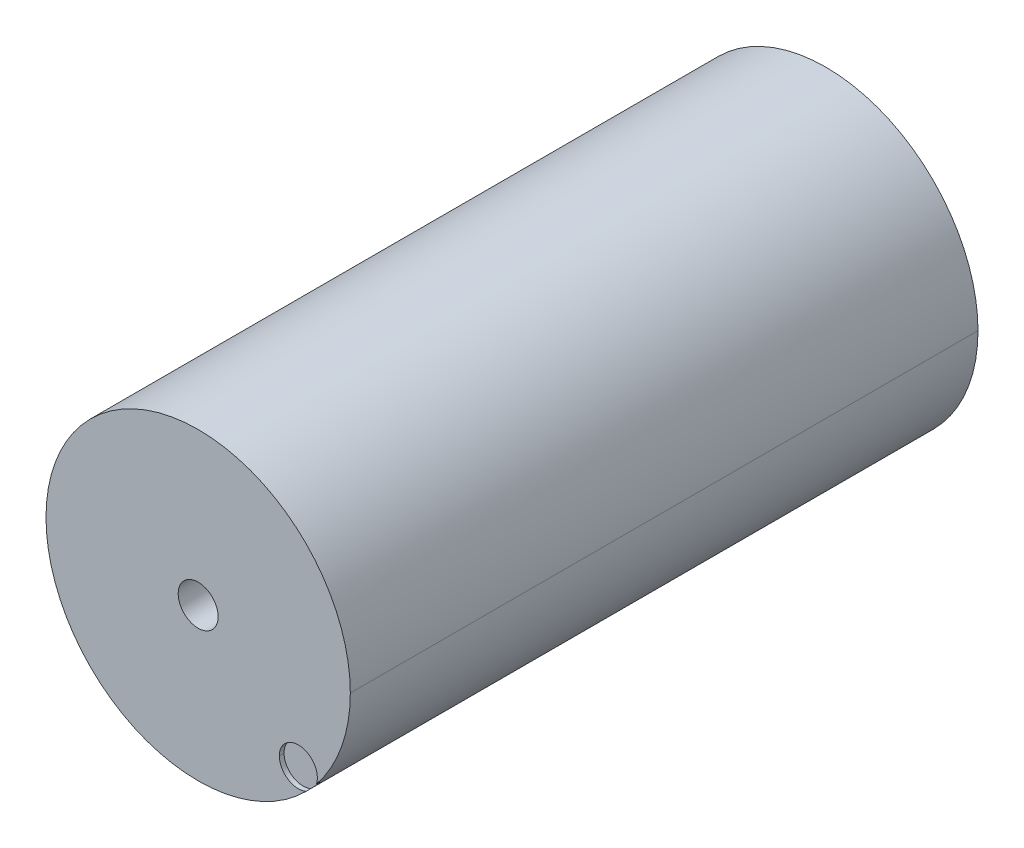
ISO-10303-21;
HEADER;
FILE_DESCRIPTION(('STEP AP214'),'2;1');
FILE_NAME('part.step','',(''),(''),'','','');
FILE_SCHEMA(('AUTOMOTIVE_DESIGN { 1 0 10303 214 1 1 1 1 }'));
ENDSEC;
DATA;
#1=APPLICATION_CONTEXT('core data for automotive mechanical design processes');
#2=APPLICATION_PROTOCOL_DEFINITION('international standard','automotive_design',2000,#1);
#3=PRODUCT_CONTEXT('',#1,'mechanical');
#4=PRODUCT('Part','Part','',(#3));
#5=PRODUCT_RELATED_PRODUCT_CATEGORY('part','',(#4));
#6=PRODUCT_DEFINITION_FORMATION('','',#4);
#7=PRODUCT_DEFINITION_CONTEXT('part definition',#1,'design');
#8=PRODUCT_DEFINITION('design','',#6,#7);
#9=PRODUCT_DEFINITION_SHAPE('','',#8);
#10=(LENGTH_UNIT() NAMED_UNIT(*) SI_UNIT(.MILLI.,.METRE.));
#11=(NAMED_UNIT(*) PLANE_ANGLE_UNIT() SI_UNIT($,.RADIAN.));
#12=(NAMED_UNIT(*) SI_UNIT($,.STERADIAN.) SOLID_ANGLE_UNIT());
#13=UNCERTAINTY_MEASURE_WITH_UNIT(LENGTH_MEASURE(1.E-05),#10,'distance_accuracy_value','');
#14=(GEOMETRIC_REPRESENTATION_CONTEXT(3) GLOBAL_UNCERTAINTY_ASSIGNED_CONTEXT((#13)) GLOBAL_UNIT_ASSIGNED_CONTEXT((#10,
#11,#12)) REPRESENTATION_CONTEXT('',''));
#15=CARTESIAN_POINT('',(0.,0.,0.));
#16=DIRECTION('',(0.,0.,1.));
#17=DIRECTION('',(1.,0.,0.));
#18=AXIS2_PLACEMENT_3D('',#15,#16,#17);
#19=CARTESIAN_POINT('',(10.5321145046291,-9.45328245563246,65.5));
#20=DIRECTION('',(0.,0.,1.));
#21=DIRECTION('',(1.,0.,0.));
#22=AXIS2_PLACEMENT_3D('',#19,#20,#21);
#23=PLANE('',#22);
#24=CARTESIAN_POINT('',(0.,0.,65.5));
#25=DIRECTION('',(0.,0.,1.));
#26=DIRECTION('',(1.,0.,0.));
#27=AXIS2_PLACEMENT_3D('',#24,#25,#26);
#28=CIRCLE('',#27,16.);
#29=CARTESIAN_POINT('',(11.3480272997679,-11.2792852789404,65.5));
#30=VERTEX_POINT('',#29);
#31=CARTESIAN_POINT('',(12.435338152409,-10.0678878139975,65.5));
#32=VERTEX_POINT('',#31);
#33=EDGE_CURVE('E59',#30,#32,#28,.T.);
#34=ORIENTED_EDGE('',*,*,#33,.T.);
#35=CARTESIAN_POINT('',(10.5321145046291,-9.45328245563246,65.5));
#36=DIRECTION('',(0.,0.,1.));
#37=DIRECTION('',(1.,0.,0.));
#38=AXIS2_PLACEMENT_3D('',#35,#36,#37);
#39=CIRCLE('',#38,2.);
#40=CARTESIAN_POINT('',(12.5321145046291,-9.45328245563246,65.5));
#41=VERTEX_POINT('',#40);
#42=EDGE_CURVE('E11',#32,#41,#39,.T.);
#43=ORIENTED_EDGE('',*,*,#42,.T.);
#44=CARTESIAN_POINT('',(10.5321145046291,-9.45328245563246,65.5));
#45=DIRECTION('',(0.,0.,1.));
#46=DIRECTION('',(1.,0.,0.));
#47=AXIS2_PLACEMENT_3D('',#44,#45,#46);
#48=CIRCLE('',#47,2.);
#49=CARTESIAN_POINT('',(8.53211450462905,-9.45328245563246,65.5));
#50=VERTEX_POINT('',#49);
#51=EDGE_CURVE('E164',#41,#50,#48,.T.);
#52=ORIENTED_EDGE('',*,*,#51,.T.);
#53=CARTESIAN_POINT('',(10.5321145046291,-9.45328245563246,65.5));
#54=DIRECTION('',(0.,0.,1.));
#55=DIRECTION('',(1.,0.,0.));
#56=AXIS2_PLACEMENT_3D('',#53,#54,#55);
#57=CIRCLE('',#56,2.);
#58=EDGE_CURVE('E158',#50,#30,#57,.T.);
#59=ORIENTED_EDGE('',*,*,#58,.T.);
#60=EDGE_LOOP('',(#34,#43,#52,#59));
#61=FACE_BOUND('',#60,.T.);
#62=ADVANCED_FACE('F48',(#61),#23,.T.);
#63=CARTESIAN_POINT('',(10.5321145046291,-9.45328245563246,65.5));
#64=DIRECTION('',(0.,0.,1.));
#65=DIRECTION('',(1.,0.,0.));
#66=AXIS2_PLACEMENT_3D('',#63,#64,#65);
#67=CYLINDRICAL_SURFACE('',#66,2.);
#68=DIRECTION('',(0.,0.,1.));
#69=VECTOR('',#68,1.);
#70=CARTESIAN_POINT('',(12.5321145046291,-9.45328245563246,65.5));
#71=LINE('',#70,#69);
#72=CARTESIAN_POINT('',(12.5321145046291,-9.45328245563246,66.));
#73=VERTEX_POINT('',#72);
#74=EDGE_CURVE('E167',#41,#73,#71,.T.);
#75=ORIENTED_EDGE('',*,*,#74,.F.);
#76=ORIENTED_EDGE('',*,*,#42,.F.);
#77=DIRECTION('',(0.,0.,-1.));
#78=VECTOR('',#77,1.);
#79=CARTESIAN_POINT('',(12.4353381524091,-10.0678878139975,67.5));
#80=LINE('',#79,#78);
#81=CARTESIAN_POINT('',(12.4353381524091,-10.0678878139975,66.));
#82=VERTEX_POINT('',#81);
#83=EDGE_CURVE('E134',#82,#32,#80,.T.);
#84=ORIENTED_EDGE('',*,*,#83,.F.);
#85=CARTESIAN_POINT('',(10.5321145046291,-9.45328245563246,66.));
#86=DIRECTION('',(0.,0.,1.));
#87=DIRECTION('',(1.,0.,0.));
#88=AXIS2_PLACEMENT_3D('',#85,#86,#87);
#89=CIRCLE('',#88,2.);
#90=EDGE_CURVE('E141',#82,#73,#89,.T.);
#91=ORIENTED_EDGE('',*,*,#90,.T.);
#92=EDGE_LOOP('',(#75,#76,#84,#91));
#93=FACE_BOUND('',#92,.T.);
#94=ADVANCED_FACE('F50',(#93),#67,.F.);
#95=CARTESIAN_POINT('',(0.,0.,66.));
#96=DIRECTION('',(0.,0.,-1.));
#97=DIRECTION('',(-1.,0.,0.));
#98=AXIS2_PLACEMENT_3D('',#95,#96,#97);
#99=CYLINDRICAL_SURFACE('',#98,16.);
#100=DIRECTION('',(0.,0.,-1.));
#101=VECTOR('',#100,1.);
#102=CARTESIAN_POINT('',(16.,0.,66.));
#103=LINE('',#102,#101);
#104=CARTESIAN_POINT('',(16.,0.,66.));
#105=VERTEX_POINT('',#104);
#106=CARTESIAN_POINT('',(16.,0.,0.));
#107=VERTEX_POINT('',#106);
#108=EDGE_CURVE('E143',#105,#107,#103,.T.);
#109=ORIENTED_EDGE('',*,*,#108,.F.);
#110=CARTESIAN_POINT('',(0.,0.,66.));
#111=DIRECTION('',(0.,0.,1.));
#112=DIRECTION('',(1.,0.,0.));
#113=AXIS2_PLACEMENT_3D('',#110,#111,#112);
#114=CIRCLE('',#113,16.);
#115=EDGE_CURVE('E154',#82,#105,#114,.T.);
#116=ORIENTED_EDGE('',*,*,#115,.F.);
#117=ORIENTED_EDGE('',*,*,#83,.T.);
#118=ORIENTED_EDGE('',*,*,#33,.F.);
#119=DIRECTION('',(0.,0.,1.));
#120=VECTOR('',#119,1.);
#121=CARTESIAN_POINT('',(11.3480272997678,-11.2792852789405,67.5));
#122=LINE('',#121,#120);
#123=CARTESIAN_POINT('',(11.3480272997678,-11.2792852789405,66.));
#124=VERTEX_POINT('',#123);
#125=EDGE_CURVE('E168',#30,#124,#122,.T.);
#126=ORIENTED_EDGE('',*,*,#125,.T.);
#127=CARTESIAN_POINT('',(0.,0.,66.));
#128=DIRECTION('',(0.,0.,1.));
#129=DIRECTION('',(1.,0.,0.));
#130=AXIS2_PLACEMENT_3D('',#127,#128,#129);
#131=CIRCLE('',#130,16.);
#132=CARTESIAN_POINT('',(-16.,0.,66.));
#133=VERTEX_POINT('',#132);
#134=EDGE_CURVE('E101',#133,#124,#131,.T.);
#135=ORIENTED_EDGE('',*,*,#134,.F.);
#136=DIRECTION('',(0.,0.,-1.));
#137=VECTOR('',#136,1.);
#138=CARTESIAN_POINT('',(-16.,0.,66.));
#139=LINE('',#138,#137);
#140=CARTESIAN_POINT('',(-16.,0.,0.));
#141=VERTEX_POINT('',#140);
#142=EDGE_CURVE('E52',#133,#141,#139,.T.);
#143=ORIENTED_EDGE('',*,*,#142,.T.);
#144=CARTESIAN_POINT('',(0.,0.,0.));
#145=DIRECTION('',(0.,0.,1.));
#146=DIRECTION('',(1.,0.,0.));
#147=AXIS2_PLACEMENT_3D('',#144,#145,#146);
#148=CIRCLE('',#147,16.);
#149=EDGE_CURVE('E125',#141,#107,#148,.T.);
#150=ORIENTED_EDGE('',*,*,#149,.T.);
#151=EDGE_LOOP('',(#109,#116,#117,#118,#126,#135,#143,#150));
#152=FACE_BOUND('',#151,.T.);
#153=ADVANCED_FACE('F137',(#152),#99,.T.);
#154=CARTESIAN_POINT('',(0.,0.,0.));
#155=DIRECTION('',(0.,0.,1.));
#156=DIRECTION('',(1.,0.,0.));
#157=AXIS2_PLACEMENT_3D('',#154,#155,#156);
#158=PLANE('',#157);
#159=CARTESIAN_POINT('',(0.,0.,0.));
#160=DIRECTION('',(0.,0.,-1.));
#161=DIRECTION('',(-1.,0.,0.));
#162=AXIS2_PLACEMENT_3D('',#159,#160,#161);
#163=CIRCLE('',#162,2.1);
#164=CARTESIAN_POINT('',(-2.1,0.,0.));
#165=VERTEX_POINT('',#164);
#166=EDGE_CURVE('E227',#165,#165,#163,.T.);
#167=ORIENTED_EDGE('',*,*,#166,.F.);
#168=EDGE_LOOP('',(#167));
#169=FACE_BOUND('',#168,.T.);
#170=ORIENTED_EDGE('',*,*,#149,.F.);
#171=CARTESIAN_POINT('',(0.,0.,0.));
#172=DIRECTION('',(0.,0.,1.));
#173=DIRECTION('',(1.,0.,0.));
#174=AXIS2_PLACEMENT_3D('',#171,#172,#173);
#175=CIRCLE('',#174,16.);
#176=EDGE_CURVE('E131',#107,#141,#175,.T.);
#177=ORIENTED_EDGE('',*,*,#176,.F.);
#178=EDGE_LOOP('',(#170,#177));
#179=FACE_BOUND('',#178,.T.);
#180=ADVANCED_FACE('F129',(#169,#179),#158,.F.);
#181=CARTESIAN_POINT('',(0.,0.,66.));
#182=DIRECTION('',(0.,0.,1.));
#183=DIRECTION('',(1.,0.,0.));
#184=AXIS2_PLACEMENT_3D('',#181,#182,#183);
#185=PLANE('',#184);
#186=CARTESIAN_POINT('',(0.,0.,66.));
#187=DIRECTION('',(0.,0.,-1.));
#188=DIRECTION('',(-1.,0.,0.));
#189=AXIS2_PLACEMENT_3D('',#186,#187,#188);
#190=CIRCLE('',#189,2.09999999999999);
#191=CARTESIAN_POINT('',(-2.09999999999999,0.,66.));
#192=VERTEX_POINT('',#191);
#193=EDGE_CURVE('E162',#192,#192,#190,.T.);
#194=ORIENTED_EDGE('',*,*,#193,.T.);
#195=EDGE_LOOP('',(#194));
#196=FACE_BOUND('',#195,.T.);
#197=ORIENTED_EDGE('',*,*,#90,.F.);
#198=ORIENTED_EDGE('',*,*,#115,.T.);
#199=CARTESIAN_POINT('',(0.,0.,66.));
#200=DIRECTION('',(0.,0.,1.));
#201=DIRECTION('',(1.,0.,0.));
#202=AXIS2_PLACEMENT_3D('',#199,#200,#201);
#203=CIRCLE('',#202,16.);
#204=EDGE_CURVE('E150',#105,#133,#203,.T.);
#205=ORIENTED_EDGE('',*,*,#204,.T.);
#206=ORIENTED_EDGE('',*,*,#134,.T.);
#207=CARTESIAN_POINT('',(10.5321145046291,-9.45328245563246,66.));
#208=DIRECTION('',(0.,0.,1.));
#209=DIRECTION('',(1.,0.,0.));
#210=AXIS2_PLACEMENT_3D('',#207,#208,#209);
#211=CIRCLE('',#210,2.);
#212=CARTESIAN_POINT('',(8.53211450462905,-9.45328245563246,66.));
#213=VERTEX_POINT('',#212);
#214=EDGE_CURVE('E169',#213,#124,#211,.T.);
#215=ORIENTED_EDGE('',*,*,#214,.F.);
#216=CARTESIAN_POINT('',(10.5321145046291,-9.45328245563246,66.));
#217=DIRECTION('',(0.,0.,1.));
#218=DIRECTION('',(1.,0.,0.));
#219=AXIS2_PLACEMENT_3D('',#216,#217,#218);
#220=CIRCLE('',#219,2.);
#221=EDGE_CURVE('E115',#73,#213,#220,.T.);
#222=ORIENTED_EDGE('',*,*,#221,.F.);
#223=EDGE_LOOP('',(#197,#198,#205,#206,#215,#222));
#224=FACE_BOUND('',#223,.T.);
#225=ADVANCED_FACE('F184',(#196,#224),#185,.T.);
#226=CARTESIAN_POINT('',(0.,0.,66.));
#227=DIRECTION('',(0.,0.,-1.));
#228=DIRECTION('',(-1.,0.,0.));
#229=AXIS2_PLACEMENT_3D('',#226,#227,#228);
#230=CYLINDRICAL_SURFACE('',#229,16.);
#231=ORIENTED_EDGE('',*,*,#204,.F.);
#232=ORIENTED_EDGE('',*,*,#108,.T.);
#233=ORIENTED_EDGE('',*,*,#176,.T.);
#234=ORIENTED_EDGE('',*,*,#142,.F.);
#235=EDGE_LOOP('',(#231,#232,#233,#234));
#236=FACE_BOUND('',#235,.T.);
#237=ADVANCED_FACE('F142',(#236),#230,.T.);
#238=CARTESIAN_POINT('',(10.5321145046291,-9.45328245563246,65.5));
#239=DIRECTION('',(0.,0.,1.));
#240=DIRECTION('',(1.,0.,0.));
#241=AXIS2_PLACEMENT_3D('',#238,#239,#240);
#242=CYLINDRICAL_SURFACE('',#241,2.);
#243=DIRECTION('',(0.,0.,1.));
#244=VECTOR('',#243,1.);
#245=CARTESIAN_POINT('',(8.53211450462905,-9.45328245563246,65.5));
#246=LINE('',#245,#244);
#247=EDGE_CURVE('E161',#50,#213,#246,.T.);
#248=ORIENTED_EDGE('',*,*,#247,.F.);
#249=ORIENTED_EDGE('',*,*,#51,.F.);
#250=ORIENTED_EDGE('',*,*,#74,.T.);
#251=ORIENTED_EDGE('',*,*,#221,.T.);
#252=EDGE_LOOP('',(#248,#249,#250,#251));
#253=FACE_BOUND('',#252,.T.);
#254=ADVANCED_FACE('F200',(#253),#242,.F.);
#255=CARTESIAN_POINT('',(10.5321145046291,-9.45328245563246,65.5));
#256=DIRECTION('',(0.,0.,1.));
#257=DIRECTION('',(1.,0.,0.));
#258=AXIS2_PLACEMENT_3D('',#255,#256,#257);
#259=CYLINDRICAL_SURFACE('',#258,2.);
#260=ORIENTED_EDGE('',*,*,#58,.F.);
#261=ORIENTED_EDGE('',*,*,#247,.T.);
#262=ORIENTED_EDGE('',*,*,#214,.T.);
#263=ORIENTED_EDGE('',*,*,#125,.F.);
#264=EDGE_LOOP('',(#260,#261,#262,#263));
#265=FACE_BOUND('',#264,.T.);
#266=ADVANCED_FACE('F198',(#265),#259,.F.);
#267=CARTESIAN_POINT('',(0.,0.,0.));
#268=DIRECTION('',(0.,0.,-1.));
#269=DIRECTION('',(-1.,0.,0.));
#270=AXIS2_PLACEMENT_3D('',#267,#268,#269);
#271=CYLINDRICAL_SURFACE('',#270,2.1);
#272=ORIENTED_EDGE('',*,*,#193,.F.);
#273=EDGE_LOOP('',(#272));
#274=FACE_BOUND('',#273,.T.);
#275=ORIENTED_EDGE('',*,*,#166,.T.);
#276=EDGE_LOOP('',(#275));
#277=FACE_BOUND('',#276,.T.);
#278=ADVANCED_FACE('F220',(#274,#277),#271,.F.);
#279=CLOSED_SHELL('',(#62,#94,#153,#180,#225,#237,#254,#266,#278));
#280=MANIFOLD_SOLID_BREP('B2',#279);
#281=ADVANCED_BREP_SHAPE_REPRESENTATION('',(#18,#280),#14);
#282=SHAPE_DEFINITION_REPRESENTATION(#9,#281);
ENDSEC;
END-ISO-10303-21;
